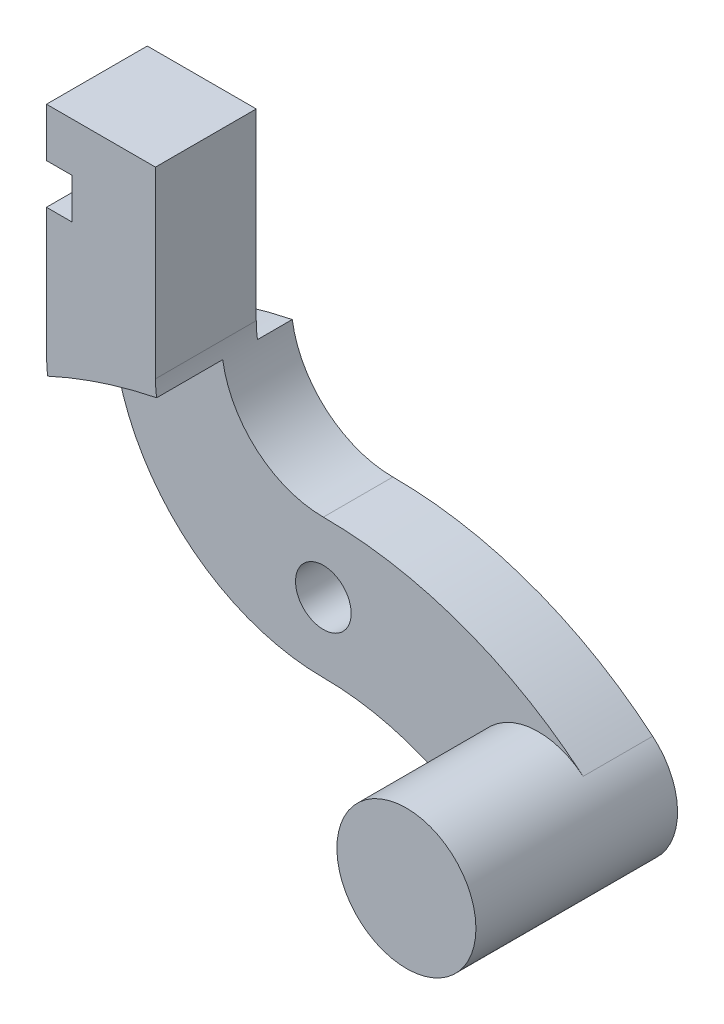
ISO-10303-21;
HEADER;
FILE_DESCRIPTION(('STEP AP214'),'2;1');
FILE_NAME('part.step','',(''),(''),'','','');
FILE_SCHEMA(('AUTOMOTIVE_DESIGN { 1 0 10303 214 1 1 1 1 }'));
ENDSEC;
DATA;
#1=APPLICATION_CONTEXT('core data for automotive mechanical design processes');
#2=APPLICATION_PROTOCOL_DEFINITION('international standard','automotive_design',2000,#1);
#3=PRODUCT_CONTEXT('',#1,'mechanical');
#4=PRODUCT('Part','Part','',(#3));
#5=PRODUCT_RELATED_PRODUCT_CATEGORY('part','',(#4));
#6=PRODUCT_DEFINITION_FORMATION('','',#4);
#7=PRODUCT_DEFINITION_CONTEXT('part definition',#1,'design');
#8=PRODUCT_DEFINITION('design','',#6,#7);
#9=PRODUCT_DEFINITION_SHAPE('','',#8);
#10=(LENGTH_UNIT() NAMED_UNIT(*) SI_UNIT(.MILLI.,.METRE.));
#11=(NAMED_UNIT(*) PLANE_ANGLE_UNIT() SI_UNIT($,.RADIAN.));
#12=(NAMED_UNIT(*) SI_UNIT($,.STERADIAN.) SOLID_ANGLE_UNIT());
#13=UNCERTAINTY_MEASURE_WITH_UNIT(LENGTH_MEASURE(1.E-05),#10,'distance_accuracy_value','');
#14=(GEOMETRIC_REPRESENTATION_CONTEXT(3) GLOBAL_UNCERTAINTY_ASSIGNED_CONTEXT((#13)) GLOBAL_UNIT_ASSIGNED_CONTEXT((#10,
#11,#12)) REPRESENTATION_CONTEXT('',''));
#15=CARTESIAN_POINT('',(0.,0.,0.));
#16=DIRECTION('',(0.,0.,1.));
#17=DIRECTION('',(1.,0.,0.));
#18=AXIS2_PLACEMENT_3D('',#15,#16,#17);
#19=CARTESIAN_POINT('',(0.,68.4739374436269,10.));
#20=DIRECTION('',(0.,0.,-1.));
#21=DIRECTION('',(-1.,0.,0.));
#22=AXIS2_PLACEMENT_3D('',#19,#20,#21);
#23=CYLINDRICAL_SURFACE('',#22,30.3239374436269);
#24=DIRECTION('',(0.,0.,-1.));
#25=VECTOR('',#24,1.);
#26=CARTESIAN_POINT('',(-30.165303473495,65.3762530767247,5.));
#27=LINE('',#26,#25);
#28=CARTESIAN_POINT('',(-30.165303473495,65.3762530767247,5.));
#29=VERTEX_POINT('',#28);
#30=CARTESIAN_POINT('',(-30.165303473495,65.3762530767247,0.));
#31=VERTEX_POINT('',#30);
#32=EDGE_CURVE('E174',#29,#31,#27,.T.);
#33=ORIENTED_EDGE('',*,*,#32,.T.);
#34=CARTESIAN_POINT('',(0.,68.4739374436269,0.));
#35=DIRECTION('',(0.,0.,1.));
#36=DIRECTION('',(1.,0.,0.));
#37=AXIS2_PLACEMENT_3D('',#34,#35,#36);
#38=CIRCLE('',#37,30.3239374436269);
#39=CARTESIAN_POINT('',(0.,38.15,0.));
#40=VERTEX_POINT('',#39);
#41=EDGE_CURVE('E244',#40,#31,#38,.F.);
#42=ORIENTED_EDGE('',*,*,#41,.F.);
#43=DIRECTION('',(0.,0.,-1.));
#44=VECTOR('',#43,1.);
#45=CARTESIAN_POINT('',(0.,38.15,10.));
#46=LINE('',#45,#44);
#47=CARTESIAN_POINT('',(0.,38.15,10.));
#48=VERTEX_POINT('',#47);
#49=EDGE_CURVE('E11',#48,#40,#46,.T.);
#50=ORIENTED_EDGE('',*,*,#49,.F.);
#51=CARTESIAN_POINT('',(0.,68.4739374436269,10.));
#52=DIRECTION('',(0.,0.,1.));
#53=DIRECTION('',(1.,0.,0.));
#54=AXIS2_PLACEMENT_3D('',#51,#52,#53);
#55=CIRCLE('',#54,30.3239374436269);
#56=CARTESIAN_POINT('',(-30.165303473495,65.3762530767247,10.));
#57=VERTEX_POINT('',#56);
#58=EDGE_CURVE('E247',#48,#57,#55,.F.);
#59=ORIENTED_EDGE('',*,*,#58,.T.);
#60=DIRECTION('',(0.,0.,-1.));
#61=VECTOR('',#60,1.);
#62=CARTESIAN_POINT('',(-30.165303473495,65.3762530767247,19.5));
#63=LINE('',#62,#61);
#64=CARTESIAN_POINT('',(-30.165303473495,65.3762530767247,19.5));
#65=VERTEX_POINT('',#64);
#66=EDGE_CURVE('E237',#65,#57,#63,.T.);
#67=ORIENTED_EDGE('',*,*,#66,.F.);
#68=CARTESIAN_POINT('',(0.,68.4739374436269,19.5));
#69=DIRECTION('',(0.,0.,1.));
#70=DIRECTION('',(1.,0.,0.));
#71=AXIS2_PLACEMENT_3D('',#68,#69,#70);
#72=CIRCLE('',#71,30.3239374436269);
#73=CARTESIAN_POINT('',(-30.3239374436269,68.4739374436269,19.5));
#74=VERTEX_POINT('',#73);
#75=EDGE_CURVE('E181',#65,#74,#72,.F.);
#76=ORIENTED_EDGE('',*,*,#75,.T.);
#77=DIRECTION('',(0.,0.,-1.));
#78=VECTOR('',#77,1.);
#79=CARTESIAN_POINT('',(-30.3239374436269,68.4739374436269,19.5));
#80=LINE('',#79,#78);
#81=CARTESIAN_POINT('',(-30.3239374436269,68.4739374436269,5.));
#82=VERTEX_POINT('',#81);
#83=EDGE_CURVE('E211',#74,#82,#80,.T.);
#84=ORIENTED_EDGE('',*,*,#83,.T.);
#85=CARTESIAN_POINT('',(0.,68.4739374436269,5.));
#86=DIRECTION('',(0.,0.,1.));
#87=DIRECTION('',(1.,0.,0.));
#88=AXIS2_PLACEMENT_3D('',#85,#86,#87);
#89=CIRCLE('',#88,30.3239374436269);
#90=EDGE_CURVE('E53',#29,#82,#89,.F.);
#91=ORIENTED_EDGE('',*,*,#90,.F.);
#92=EDGE_LOOP('',(#33,#42,#50,#59,#67,#76,#84,#91));
#93=FACE_BOUND('',#92,.T.);
#94=ADVANCED_FACE('F39',(#93),#23,.T.);
#95=CARTESIAN_POINT('',(0.,0.,10.));
#96=DIRECTION('',(0.,0.,-1.));
#97=DIRECTION('',(-1.,0.,0.));
#98=AXIS2_PLACEMENT_3D('',#95,#96,#97);
#99=CYLINDRICAL_SURFACE('',#98,38.15);
#100=CARTESIAN_POINT('',(0.,0.,0.));
#101=DIRECTION('',(0.,0.,1.));
#102=DIRECTION('',(1.,0.,0.));
#103=AXIS2_PLACEMENT_3D('',#100,#101,#102);
#104=CIRCLE('',#103,38.15);
#105=CARTESIAN_POINT('',(24.5223473095413,29.2245955049892,0.));
#106=VERTEX_POINT('',#105);
#107=EDGE_CURVE('E264',#106,#40,#104,.T.);
#108=ORIENTED_EDGE('',*,*,#107,.F.);
#109=DIRECTION('',(0.,0.,-1.));
#110=VECTOR('',#109,1.);
#111=CARTESIAN_POINT('',(24.5223473095413,29.2245955049892,10.));
#112=LINE('',#111,#110);
#113=CARTESIAN_POINT('',(24.5223473095413,29.2245955049892,10.));
#114=VERTEX_POINT('',#113);
#115=EDGE_CURVE('E46',#114,#106,#112,.T.);
#116=ORIENTED_EDGE('',*,*,#115,.F.);
#117=CARTESIAN_POINT('',(0.,0.,10.));
#118=DIRECTION('',(0.,0.,1.));
#119=DIRECTION('',(1.,0.,0.));
#120=AXIS2_PLACEMENT_3D('',#117,#118,#119);
#121=CIRCLE('',#120,38.15);
#122=EDGE_CURVE('E250',#114,#48,#121,.T.);
#123=ORIENTED_EDGE('',*,*,#122,.T.);
#124=ORIENTED_EDGE('',*,*,#49,.T.);
#125=EDGE_LOOP('',(#108,#116,#123,#124));
#126=FACE_BOUND('',#125,.T.);
#127=ADVANCED_FACE('F281',(#126),#99,.F.);
#128=CARTESIAN_POINT('',(0.,0.,10.));
#129=DIRECTION('',(0.,0.,-1.));
#130=DIRECTION('',(-1.,0.,0.));
#131=AXIS2_PLACEMENT_3D('',#128,#129,#130);
#132=CYLINDRICAL_SURFACE('',#131,58.15);
#133=CARTESIAN_POINT('',(0.,0.,0.));
#134=DIRECTION('',(0.,0.,1.));
#135=DIRECTION('',(1.,0.,0.));
#136=AXIS2_PLACEMENT_3D('',#133,#134,#135);
#137=CIRCLE('',#136,58.15);
#138=CARTESIAN_POINT('',(37.378099503272,44.5454843673688,0.));
#139=VERTEX_POINT('',#138);
#140=CARTESIAN_POINT('',(0.,58.15,0.));
#141=VERTEX_POINT('',#140);
#142=EDGE_CURVE('E80',#139,#141,#137,.T.);
#143=ORIENTED_EDGE('',*,*,#142,.T.);
#144=DIRECTION('',(0.,0.,-1.));
#145=VECTOR('',#144,1.);
#146=CARTESIAN_POINT('',(0.,58.15,10.));
#147=LINE('',#146,#145);
#148=CARTESIAN_POINT('',(0.,58.15,10.));
#149=VERTEX_POINT('',#148);
#150=EDGE_CURVE('E261',#149,#141,#147,.T.);
#151=ORIENTED_EDGE('',*,*,#150,.F.);
#152=CARTESIAN_POINT('',(0.,0.,10.));
#153=DIRECTION('',(0.,0.,1.));
#154=DIRECTION('',(1.,0.,0.));
#155=AXIS2_PLACEMENT_3D('',#152,#153,#154);
#156=CIRCLE('',#155,58.15);
#157=CARTESIAN_POINT('',(37.378099503272,44.5454843673688,10.));
#158=VERTEX_POINT('',#157);
#159=EDGE_CURVE('E255',#158,#149,#156,.T.);
#160=ORIENTED_EDGE('',*,*,#159,.F.);
#161=DIRECTION('',(0.,0.,-1.));
#162=VECTOR('',#161,1.);
#163=CARTESIAN_POINT('',(37.378099503272,44.5454843673688,10.));
#164=LINE('',#163,#162);
#165=EDGE_CURVE('E272',#158,#139,#164,.T.);
#166=ORIENTED_EDGE('',*,*,#165,.T.);
#167=EDGE_LOOP('',(#143,#151,#160,#166));
#168=FACE_BOUND('',#167,.T.);
#169=ADVANCED_FACE('F326',(#168),#132,.T.);
#170=CARTESIAN_POINT('',(0.,72.8005824786606,10.));
#171=DIRECTION('',(0.,0.,-1.));
#172=DIRECTION('',(-1.,0.,0.));
#173=AXIS2_PLACEMENT_3D('',#170,#171,#172);
#174=CYLINDRICAL_SURFACE('',#173,14.6505824786606);
#175=CARTESIAN_POINT('',(0.,72.8005824786606,0.));
#176=DIRECTION('',(0.,0.,1.));
#177=DIRECTION('',(1.,0.,0.));
#178=AXIS2_PLACEMENT_3D('',#175,#176,#177);
#179=CIRCLE('',#178,14.6505824786606);
#180=CARTESIAN_POINT('',(-14.4736006632229,70.5302409172232,0.));
#181=VERTEX_POINT('',#180);
#182=EDGE_CURVE('E180',#141,#181,#179,.F.);
#183=ORIENTED_EDGE('',*,*,#182,.T.);
#184=DIRECTION('',(0.,0.,-1.));
#185=VECTOR('',#184,1.);
#186=CARTESIAN_POINT('',(-14.4736006632229,70.5302409172232,5.));
#187=LINE('',#186,#185);
#188=CARTESIAN_POINT('',(-14.4736006632229,70.5302409172232,5.));
#189=VERTEX_POINT('',#188);
#190=EDGE_CURVE('E171',#189,#181,#187,.T.);
#191=ORIENTED_EDGE('',*,*,#190,.F.);
#192=CARTESIAN_POINT('',(0.,72.8005824786606,5.));
#193=DIRECTION('',(0.,0.,1.));
#194=DIRECTION('',(1.,0.,0.));
#195=AXIS2_PLACEMENT_3D('',#192,#193,#194);
#196=CIRCLE('',#195,14.6505824786606);
#197=CARTESIAN_POINT('',(-14.6505824786606,72.8005824786606,5.));
#198=VERTEX_POINT('',#197);
#199=EDGE_CURVE('E158',#189,#198,#196,.F.);
#200=ORIENTED_EDGE('',*,*,#199,.T.);
#201=DIRECTION('',(0.,0.,-1.));
#202=VECTOR('',#201,1.);
#203=CARTESIAN_POINT('',(-14.6505824786606,72.8005824786606,19.5));
#204=LINE('',#203,#202);
#205=CARTESIAN_POINT('',(-14.6505824786606,72.8005824786606,19.5));
#206=VERTEX_POINT('',#205);
#207=EDGE_CURVE('E232',#206,#198,#204,.T.);
#208=ORIENTED_EDGE('',*,*,#207,.F.);
#209=CARTESIAN_POINT('',(0.,72.8005824786606,19.5));
#210=DIRECTION('',(0.,0.,1.));
#211=DIRECTION('',(1.,0.,0.));
#212=AXIS2_PLACEMENT_3D('',#209,#210,#211);
#213=CIRCLE('',#212,14.6505824786606);
#214=CARTESIAN_POINT('',(-14.4736006632229,70.5302409172232,19.5));
#215=VERTEX_POINT('',#214);
#216=EDGE_CURVE('E191',#215,#206,#213,.F.);
#217=ORIENTED_EDGE('',*,*,#216,.F.);
#218=DIRECTION('',(0.,0.,-1.));
#219=VECTOR('',#218,1.);
#220=CARTESIAN_POINT('',(-14.4736006632229,70.5302409172232,19.5));
#221=LINE('',#220,#219);
#222=CARTESIAN_POINT('',(-14.4736006632229,70.5302409172232,10.));
#223=VERTEX_POINT('',#222);
#224=EDGE_CURVE('E234',#215,#223,#221,.T.);
#225=ORIENTED_EDGE('',*,*,#224,.T.);
#226=CARTESIAN_POINT('',(0.,72.8005824786606,10.));
#227=DIRECTION('',(0.,0.,1.));
#228=DIRECTION('',(1.,0.,0.));
#229=AXIS2_PLACEMENT_3D('',#226,#227,#228);
#230=CIRCLE('',#229,14.6505824786606);
#231=EDGE_CURVE('E62',#149,#223,#230,.F.);
#232=ORIENTED_EDGE('',*,*,#231,.F.);
#233=ORIENTED_EDGE('',*,*,#150,.T.);
#234=EDGE_LOOP('',(#183,#191,#200,#208,#217,#225,#232,#233));
#235=FACE_BOUND('',#234,.T.);
#236=ADVANCED_FACE('F178',(#235),#174,.F.);
#237=CARTESIAN_POINT('',(0.,48.15,10.));
#238=DIRECTION('',(0.,0.,-1.));
#239=DIRECTION('',(-1.,0.,0.));
#240=AXIS2_PLACEMENT_3D('',#237,#238,#239);
#241=CYLINDRICAL_SURFACE('',#240,4.);
#242=CARTESIAN_POINT('',(0.,48.15,10.));
#243=DIRECTION('',(0.,0.,1.));
#244=DIRECTION('',(1.,0.,0.));
#245=AXIS2_PLACEMENT_3D('',#242,#243,#244);
#246=CIRCLE('',#245,4.);
#247=CARTESIAN_POINT('',(4.,48.15,10.));
#248=VERTEX_POINT('',#247);
#249=EDGE_CURVE('E258',#248,#248,#246,.T.);
#250=ORIENTED_EDGE('',*,*,#249,.T.);
#251=EDGE_LOOP('',(#250));
#252=FACE_BOUND('',#251,.T.);
#253=CARTESIAN_POINT('',(0.,48.15,0.));
#254=DIRECTION('',(0.,0.,1.));
#255=DIRECTION('',(1.,0.,0.));
#256=AXIS2_PLACEMENT_3D('',#253,#254,#255);
#257=CIRCLE('',#256,4.);
#258=CARTESIAN_POINT('',(4.,48.15,0.));
#259=VERTEX_POINT('',#258);
#260=EDGE_CURVE('E248',#259,#259,#257,.T.);
#261=ORIENTED_EDGE('',*,*,#260,.F.);
#262=EDGE_LOOP('',(#261));
#263=FACE_BOUND('',#262,.T.);
#264=ADVANCED_FACE('F333',(#252,#263),#241,.F.);
#265=CARTESIAN_POINT('',(0.,0.,10.));
#266=DIRECTION('',(0.,0.,1.));
#267=DIRECTION('',(1.,0.,0.));
#268=AXIS2_PLACEMENT_3D('',#265,#266,#267);
#269=PLANE('',#268);
#270=CARTESIAN_POINT('',(0.,0.,10.));
#271=DIRECTION('',(0.,0.,1.));
#272=DIRECTION('',(1.,0.,0.));
#273=AXIS2_PLACEMENT_3D('',#270,#271,#272);
#274=CIRCLE('',#273,72.);
#275=EDGE_CURVE('E84',#223,#57,#274,.T.);
#276=ORIENTED_EDGE('',*,*,#275,.T.);
#277=ORIENTED_EDGE('',*,*,#58,.F.);
#278=ORIENTED_EDGE('',*,*,#122,.F.);
#279=CARTESIAN_POINT('',(30.9502234064066,36.885039936179,10.));
#280=DIRECTION('',(0.,0.,1.));
#281=DIRECTION('',(1.,0.,0.));
#282=AXIS2_PLACEMENT_3D('',#279,#280,#281);
#283=CIRCLE('',#282,10.);
#284=EDGE_CURVE('E253',#158,#114,#283,.T.);
#285=ORIENTED_EDGE('',*,*,#284,.F.);
#286=ORIENTED_EDGE('',*,*,#159,.T.);
#287=ORIENTED_EDGE('',*,*,#231,.T.);
#288=EDGE_LOOP('',(#276,#277,#278,#285,#286,#287));
#289=FACE_BOUND('',#288,.T.);
#290=ORIENTED_EDGE('',*,*,#249,.F.);
#291=EDGE_LOOP('',(#290));
#292=FACE_BOUND('',#291,.T.);
#293=ADVANCED_FACE('F323',(#289,#292),#269,.T.);
#294=CARTESIAN_POINT('',(0.,0.,0.));
#295=DIRECTION('',(0.,0.,1.));
#296=DIRECTION('',(1.,0.,0.));
#297=AXIS2_PLACEMENT_3D('',#294,#295,#296);
#298=PLANE('',#297);
#299=ORIENTED_EDGE('',*,*,#41,.T.);
#300=CARTESIAN_POINT('',(0.,0.,0.));
#301=DIRECTION('',(0.,0.,1.));
#302=DIRECTION('',(1.,0.,0.));
#303=AXIS2_PLACEMENT_3D('',#300,#301,#302);
#304=CIRCLE('',#303,72.);
#305=EDGE_CURVE('E175',#181,#31,#304,.T.);
#306=ORIENTED_EDGE('',*,*,#305,.F.);
#307=ORIENTED_EDGE('',*,*,#182,.F.);
#308=ORIENTED_EDGE('',*,*,#142,.F.);
#309=CARTESIAN_POINT('',(30.9502234064066,36.885039936179,0.));
#310=DIRECTION('',(0.,0.,1.));
#311=DIRECTION('',(1.,0.,0.));
#312=AXIS2_PLACEMENT_3D('',#309,#310,#311);
#313=CIRCLE('',#312,10.);
#314=EDGE_CURVE('E240',#106,#139,#313,.T.);
#315=ORIENTED_EDGE('',*,*,#314,.F.);
#316=ORIENTED_EDGE('',*,*,#107,.T.);
#317=EDGE_LOOP('',(#299,#306,#307,#308,#315,#316));
#318=FACE_BOUND('',#317,.T.);
#319=ORIENTED_EDGE('',*,*,#260,.T.);
#320=EDGE_LOOP('',(#319));
#321=FACE_BOUND('',#320,.T.);
#322=ADVANCED_FACE('F284',(#318,#321),#298,.F.);
#323=CARTESIAN_POINT('',(30.9502234064066,36.885039936179,29.));
#324=DIRECTION('',(0.,0.,-1.));
#325=DIRECTION('',(-1.,0.,0.));
#326=AXIS2_PLACEMENT_3D('',#323,#324,#325);
#327=CYLINDRICAL_SURFACE('',#326,10.);
#328=CARTESIAN_POINT('',(30.9502234064066,36.885039936179,29.));
#329=DIRECTION('',(0.,0.,1.));
#330=DIRECTION('',(1.,0.,0.));
#331=AXIS2_PLACEMENT_3D('',#328,#329,#330);
#332=CIRCLE('',#331,10.);
#333=CARTESIAN_POINT('',(40.9502234064066,36.885039936179,29.));
#334=VERTEX_POINT('',#333);
#335=EDGE_CURVE('E241',#334,#334,#332,.T.);
#336=ORIENTED_EDGE('',*,*,#335,.F.);
#337=EDGE_LOOP('',(#336));
#338=FACE_BOUND('',#337,.T.);
#339=ORIENTED_EDGE('',*,*,#284,.T.);
#340=ORIENTED_EDGE('',*,*,#115,.T.);
#341=ORIENTED_EDGE('',*,*,#314,.T.);
#342=ORIENTED_EDGE('',*,*,#165,.F.);
#343=EDGE_LOOP('',(#339,#340,#341,#342));
#344=FACE_BOUND('',#343,.T.);
#345=ADVANCED_FACE('F277',(#338,#344),#327,.T.);
#346=CARTESIAN_POINT('',(0.,0.,29.));
#347=DIRECTION('',(0.,0.,1.));
#348=DIRECTION('',(1.,0.,0.));
#349=AXIS2_PLACEMENT_3D('',#346,#347,#348);
#350=PLANE('',#349);
#351=ORIENTED_EDGE('',*,*,#335,.T.);
#352=EDGE_LOOP('',(#351));
#353=FACE_BOUND('',#352,.T.);
#354=ADVANCED_FACE('F363',(#353),#350,.T.);
#355=CARTESIAN_POINT('',(0.,0.,19.5));
#356=DIRECTION('',(0.,0.,-1.));
#357=DIRECTION('',(-1.,0.,0.));
#358=AXIS2_PLACEMENT_3D('',#355,#356,#357);
#359=CYLINDRICAL_SURFACE('',#358,72.);
#360=ORIENTED_EDGE('',*,*,#66,.T.);
#361=ORIENTED_EDGE('',*,*,#275,.F.);
#362=ORIENTED_EDGE('',*,*,#224,.F.);
#363=CARTESIAN_POINT('',(0.,0.,19.5));
#364=DIRECTION('',(0.,0.,1.));
#365=DIRECTION('',(1.,0.,0.));
#366=AXIS2_PLACEMENT_3D('',#363,#364,#365);
#367=CIRCLE('',#366,72.);
#368=EDGE_CURVE('E184',#215,#65,#367,.T.);
#369=ORIENTED_EDGE('',*,*,#368,.T.);
#370=EDGE_LOOP('',(#360,#361,#362,#369));
#371=FACE_BOUND('',#370,.T.);
#372=ADVANCED_FACE('F321',(#371),#359,.F.);
#373=CARTESIAN_POINT('',(-14.6505824786606,0.,19.5));
#374=DIRECTION('',(1.,0.,0.));
#375=DIRECTION('',(0.,1.,0.));
#376=AXIS2_PLACEMENT_3D('',#373,#374,#375);
#377=PLANE('',#376);
#378=DIRECTION('',(0.,-1.,0.));
#379=VECTOR('',#378,1.);
#380=CARTESIAN_POINT('',(-14.6505824786606,0.,5.));
#381=LINE('',#380,#379);
#382=CARTESIAN_POINT('',(-14.6505824786606,99.1763287812981,5.));
#383=VERTEX_POINT('',#382);
#384=EDGE_CURVE('E163',#383,#198,#381,.T.);
#385=ORIENTED_EDGE('',*,*,#384,.F.);
#386=DIRECTION('',(0.,0.,-1.));
#387=VECTOR('',#386,1.);
#388=CARTESIAN_POINT('',(-14.6505824786606,99.1763287812981,19.5));
#389=LINE('',#388,#387);
#390=CARTESIAN_POINT('',(-14.6505824786606,99.1763287812981,19.5));
#391=VERTEX_POINT('',#390);
#392=EDGE_CURVE('E229',#391,#383,#389,.T.);
#393=ORIENTED_EDGE('',*,*,#392,.F.);
#394=DIRECTION('',(0.,-1.,0.));
#395=VECTOR('',#394,1.);
#396=CARTESIAN_POINT('',(-14.6505824786606,0.,19.5));
#397=LINE('',#396,#395);
#398=EDGE_CURVE('E193',#391,#206,#397,.T.);
#399=ORIENTED_EDGE('',*,*,#398,.T.);
#400=ORIENTED_EDGE('',*,*,#207,.T.);
#401=EDGE_LOOP('',(#385,#393,#399,#400));
#402=FACE_BOUND('',#401,.T.);
#403=ADVANCED_FACE('F319',(#402),#377,.T.);
#404=CARTESIAN_POINT('',(0.,99.1763287812981,19.5));
#405=DIRECTION('',(0.,-1.,0.));
#406=DIRECTION('',(0.,0.,-1.));
#407=AXIS2_PLACEMENT_3D('',#404,#405,#406);
#408=PLANE('',#407);
#409=ORIENTED_EDGE('',*,*,#392,.T.);
#410=DIRECTION('',(-1.,0.,0.));
#411=VECTOR('',#410,1.);
#412=CARTESIAN_POINT('',(0.,99.1763287812981,5.));
#413=LINE('',#412,#411);
#414=CARTESIAN_POINT('',(-30.3239374436269,99.1763287812981,5.));
#415=VERTEX_POINT('',#414);
#416=EDGE_CURVE('E299',#383,#415,#413,.T.);
#417=ORIENTED_EDGE('',*,*,#416,.T.);
#418=DIRECTION('',(0.,0.,-1.));
#419=VECTOR('',#418,1.);
#420=CARTESIAN_POINT('',(-30.3239374436269,99.1763287812981,19.5));
#421=LINE('',#420,#419);
#422=CARTESIAN_POINT('',(-30.3239374436269,99.1763287812981,19.5));
#423=VERTEX_POINT('',#422);
#424=EDGE_CURVE('E226',#423,#415,#421,.T.);
#425=ORIENTED_EDGE('',*,*,#424,.F.);
#426=DIRECTION('',(-1.,0.,0.));
#427=VECTOR('',#426,1.);
#428=CARTESIAN_POINT('',(0.,99.1763287812981,19.5));
#429=LINE('',#428,#427);
#430=EDGE_CURVE('E196',#391,#423,#429,.T.);
#431=ORIENTED_EDGE('',*,*,#430,.F.);
#432=EDGE_LOOP('',(#409,#417,#425,#431));
#433=FACE_BOUND('',#432,.T.);
#434=ADVANCED_FACE('F304',(#433),#408,.F.);
#435=CARTESIAN_POINT('',(-30.3239374436269,0.,19.5));
#436=DIRECTION('',(1.,0.,0.));
#437=DIRECTION('',(0.,0.,-1.));
#438=AXIS2_PLACEMENT_3D('',#435,#436,#437);
#439=PLANE('',#438);
#440=ORIENTED_EDGE('',*,*,#424,.T.);
#441=DIRECTION('',(0.,-1.,0.));
#442=VECTOR('',#441,1.);
#443=CARTESIAN_POINT('',(-30.3239374436269,0.,5.));
#444=LINE('',#443,#442);
#445=CARTESIAN_POINT('',(-30.3239374436269,92.15,5.));
#446=VERTEX_POINT('',#445);
#447=EDGE_CURVE('E296',#415,#446,#444,.T.);
#448=ORIENTED_EDGE('',*,*,#447,.T.);
#449=DIRECTION('',(0.,0.,-1.));
#450=VECTOR('',#449,1.);
#451=CARTESIAN_POINT('',(-30.3239374436269,92.15,19.5));
#452=LINE('',#451,#450);
#453=CARTESIAN_POINT('',(-30.3239374436269,92.15,19.5));
#454=VERTEX_POINT('',#453);
#455=EDGE_CURVE('E223',#454,#446,#452,.T.);
#456=ORIENTED_EDGE('',*,*,#455,.F.);
#457=DIRECTION('',(0.,-1.,0.));
#458=VECTOR('',#457,1.);
#459=CARTESIAN_POINT('',(-30.3239374436269,0.,19.5));
#460=LINE('',#459,#458);
#461=EDGE_CURVE('E198',#423,#454,#460,.T.);
#462=ORIENTED_EDGE('',*,*,#461,.F.);
#463=EDGE_LOOP('',(#440,#448,#456,#462));
#464=FACE_BOUND('',#463,.T.);
#465=ADVANCED_FACE('F308',(#464),#439,.F.);
#466=CARTESIAN_POINT('',(0.,92.15,19.5));
#467=DIRECTION('',(0.,-1.,0.));
#468=DIRECTION('',(0.,0.,-1.));
#469=AXIS2_PLACEMENT_3D('',#466,#467,#468);
#470=PLANE('',#469);
#471=DIRECTION('',(-1.,0.,0.));
#472=VECTOR('',#471,1.);
#473=CARTESIAN_POINT('',(0.,92.15,5.));
#474=LINE('',#473,#472);
#475=CARTESIAN_POINT('',(-26.6827957811037,92.15,5.));
#476=VERTEX_POINT('',#475);
#477=EDGE_CURVE('E294',#476,#446,#474,.T.);
#478=ORIENTED_EDGE('',*,*,#477,.F.);
#479=DIRECTION('',(0.,0.,-1.));
#480=VECTOR('',#479,1.);
#481=CARTESIAN_POINT('',(-26.6827957811037,92.15,19.5));
#482=LINE('',#481,#480);
#483=CARTESIAN_POINT('',(-26.6827957811037,92.15,19.5));
#484=VERTEX_POINT('',#483);
#485=EDGE_CURVE('E220',#484,#476,#482,.T.);
#486=ORIENTED_EDGE('',*,*,#485,.F.);
#487=DIRECTION('',(-1.,0.,0.));
#488=VECTOR('',#487,1.);
#489=CARTESIAN_POINT('',(0.,92.15,19.5));
#490=LINE('',#489,#488);
#491=EDGE_CURVE('E200',#484,#454,#490,.T.);
#492=ORIENTED_EDGE('',*,*,#491,.T.);
#493=ORIENTED_EDGE('',*,*,#455,.T.);
#494=EDGE_LOOP('',(#478,#486,#492,#493));
#495=FACE_BOUND('',#494,.T.);
#496=ADVANCED_FACE('F442',(#495),#470,.T.);
#497=CARTESIAN_POINT('',(-26.6827957811037,0.,19.5));
#498=DIRECTION('',(-1.,0.,0.));
#499=DIRECTION('',(0.,0.,1.));
#500=AXIS2_PLACEMENT_3D('',#497,#498,#499);
#501=PLANE('',#500);
#502=DIRECTION('',(0.,1.,0.));
#503=VECTOR('',#502,1.);
#504=CARTESIAN_POINT('',(-26.6827957811037,0.,5.));
#505=LINE('',#504,#503);
#506=CARTESIAN_POINT('',(-26.6827957811037,86.3386728233624,5.));
#507=VERTEX_POINT('',#506);
#508=EDGE_CURVE('E292',#507,#476,#505,.T.);
#509=ORIENTED_EDGE('',*,*,#508,.F.);
#510=DIRECTION('',(0.,0.,-1.));
#511=VECTOR('',#510,1.);
#512=CARTESIAN_POINT('',(-26.6827957811037,86.3386728233624,19.5));
#513=LINE('',#512,#511);
#514=CARTESIAN_POINT('',(-26.6827957811037,86.3386728233624,19.5));
#515=VERTEX_POINT('',#514);
#516=EDGE_CURVE('E217',#515,#507,#513,.T.);
#517=ORIENTED_EDGE('',*,*,#516,.F.);
#518=DIRECTION('',(0.,1.,0.));
#519=VECTOR('',#518,1.);
#520=CARTESIAN_POINT('',(-26.6827957811037,0.,19.5));
#521=LINE('',#520,#519);
#522=EDGE_CURVE('E203',#515,#484,#521,.T.);
#523=ORIENTED_EDGE('',*,*,#522,.T.);
#524=ORIENTED_EDGE('',*,*,#485,.T.);
#525=EDGE_LOOP('',(#509,#517,#523,#524));
#526=FACE_BOUND('',#525,.T.);
#527=ADVANCED_FACE('F438',(#526),#501,.T.);
#528=CARTESIAN_POINT('',(0.,86.3386728233624,19.5));
#529=DIRECTION('',(0.,1.,0.));
#530=DIRECTION('',(0.,0.,1.));
#531=AXIS2_PLACEMENT_3D('',#528,#529,#530);
#532=PLANE('',#531);
#533=DIRECTION('',(1.,0.,0.));
#534=VECTOR('',#533,1.);
#535=CARTESIAN_POINT('',(0.,86.3386728233624,5.));
#536=LINE('',#535,#534);
#537=CARTESIAN_POINT('',(-30.3239374436269,86.3386728233624,5.));
#538=VERTEX_POINT('',#537);
#539=EDGE_CURVE('E290',#538,#507,#536,.T.);
#540=ORIENTED_EDGE('',*,*,#539,.F.);
#541=DIRECTION('',(0.,0.,-1.));
#542=VECTOR('',#541,1.);
#543=CARTESIAN_POINT('',(-30.3239374436269,86.3386728233624,19.5));
#544=LINE('',#543,#542);
#545=CARTESIAN_POINT('',(-30.3239374436269,86.3386728233624,19.5));
#546=VERTEX_POINT('',#545);
#547=EDGE_CURVE('E214',#546,#538,#544,.T.);
#548=ORIENTED_EDGE('',*,*,#547,.F.);
#549=DIRECTION('',(1.,0.,0.));
#550=VECTOR('',#549,1.);
#551=CARTESIAN_POINT('',(0.,86.3386728233624,19.5));
#552=LINE('',#551,#550);
#553=EDGE_CURVE('E206',#546,#515,#552,.T.);
#554=ORIENTED_EDGE('',*,*,#553,.T.);
#555=ORIENTED_EDGE('',*,*,#516,.T.);
#556=EDGE_LOOP('',(#540,#548,#554,#555));
#557=FACE_BOUND('',#556,.T.);
#558=ADVANCED_FACE('F435',(#557),#532,.T.);
#559=CARTESIAN_POINT('',(-30.3239374436269,0.,19.5));
#560=DIRECTION('',(1.,0.,0.));
#561=DIRECTION('',(0.,0.,-1.));
#562=AXIS2_PLACEMENT_3D('',#559,#560,#561);
#563=PLANE('',#562);
#564=ORIENTED_EDGE('',*,*,#547,.T.);
#565=DIRECTION('',(0.,-1.,0.));
#566=VECTOR('',#565,1.);
#567=CARTESIAN_POINT('',(-30.3239374436269,0.,5.));
#568=LINE('',#567,#566);
#569=EDGE_CURVE('E288',#538,#82,#568,.T.);
#570=ORIENTED_EDGE('',*,*,#569,.T.);
#571=ORIENTED_EDGE('',*,*,#83,.F.);
#572=DIRECTION('',(0.,-1.,0.));
#573=VECTOR('',#572,1.);
#574=CARTESIAN_POINT('',(-30.3239374436269,0.,19.5));
#575=LINE('',#574,#573);
#576=EDGE_CURVE('E209',#546,#74,#575,.T.);
#577=ORIENTED_EDGE('',*,*,#576,.F.);
#578=EDGE_LOOP('',(#564,#570,#571,#577));
#579=FACE_BOUND('',#578,.T.);
#580=ADVANCED_FACE('F404',(#579),#563,.F.);
#581=CARTESIAN_POINT('',(0.,0.,19.5));
#582=DIRECTION('',(0.,0.,1.));
#583=DIRECTION('',(1.,0.,0.));
#584=AXIS2_PLACEMENT_3D('',#581,#582,#583);
#585=PLANE('',#584);
#586=ORIENTED_EDGE('',*,*,#75,.F.);
#587=ORIENTED_EDGE('',*,*,#368,.F.);
#588=ORIENTED_EDGE('',*,*,#216,.T.);
#589=ORIENTED_EDGE('',*,*,#398,.F.);
#590=ORIENTED_EDGE('',*,*,#430,.T.);
#591=ORIENTED_EDGE('',*,*,#461,.T.);
#592=ORIENTED_EDGE('',*,*,#491,.F.);
#593=ORIENTED_EDGE('',*,*,#522,.F.);
#594=ORIENTED_EDGE('',*,*,#553,.F.);
#595=ORIENTED_EDGE('',*,*,#576,.T.);
#596=EDGE_LOOP('',(#586,#587,#588,#589,#590,#591,#592,#593,#594,#595));
#597=FACE_BOUND('',#596,.T.);
#598=ADVANCED_FACE('F313',(#597),#585,.T.);
#599=CARTESIAN_POINT('',(0.,0.,5.));
#600=DIRECTION('',(0.,0.,-1.));
#601=DIRECTION('',(-1.,0.,0.));
#602=AXIS2_PLACEMENT_3D('',#599,#600,#601);
#603=CYLINDRICAL_SURFACE('',#602,72.);
#604=ORIENTED_EDGE('',*,*,#305,.T.);
#605=ORIENTED_EDGE('',*,*,#32,.F.);
#606=CARTESIAN_POINT('',(0.,0.,5.));
#607=DIRECTION('',(0.,0.,1.));
#608=DIRECTION('',(1.,0.,0.));
#609=AXIS2_PLACEMENT_3D('',#606,#607,#608);
#610=CIRCLE('',#609,72.);
#611=EDGE_CURVE('E161',#189,#29,#610,.T.);
#612=ORIENTED_EDGE('',*,*,#611,.F.);
#613=ORIENTED_EDGE('',*,*,#190,.T.);
#614=EDGE_LOOP('',(#604,#605,#612,#613));
#615=FACE_BOUND('',#614,.T.);
#616=ADVANCED_FACE('F170',(#615),#603,.T.);
#617=CARTESIAN_POINT('',(0.,0.,5.));
#618=DIRECTION('',(0.,0.,1.));
#619=DIRECTION('',(1.,0.,0.));
#620=AXIS2_PLACEMENT_3D('',#617,#618,#619);
#621=PLANE('',#620);
#622=ORIENTED_EDGE('',*,*,#611,.T.);
#623=ORIENTED_EDGE('',*,*,#90,.T.);
#624=ORIENTED_EDGE('',*,*,#569,.F.);
#625=ORIENTED_EDGE('',*,*,#539,.T.);
#626=ORIENTED_EDGE('',*,*,#508,.T.);
#627=ORIENTED_EDGE('',*,*,#477,.T.);
#628=ORIENTED_EDGE('',*,*,#447,.F.);
#629=ORIENTED_EDGE('',*,*,#416,.F.);
#630=ORIENTED_EDGE('',*,*,#384,.T.);
#631=ORIENTED_EDGE('',*,*,#199,.F.);
#632=EDGE_LOOP('',(#622,#623,#624,#625,#626,#627,#628,#629,#630,#631));
#633=FACE_BOUND('',#632,.T.);
#634=ADVANCED_FACE('F160',(#633),#621,.F.);
#635=CLOSED_SHELL('',(#94,#127,#169,#236,#264,#293,#322,#345,#354,#372,#403,#434,#465,#496,#527,
#558,#580,#598,#616,#634));
#636=MANIFOLD_SOLID_BREP('B2',#635);
#637=ADVANCED_BREP_SHAPE_REPRESENTATION('',(#18,#636),#14);
#638=SHAPE_DEFINITION_REPRESENTATION(#9,#637);
ENDSEC;
END-ISO-10303-21;
